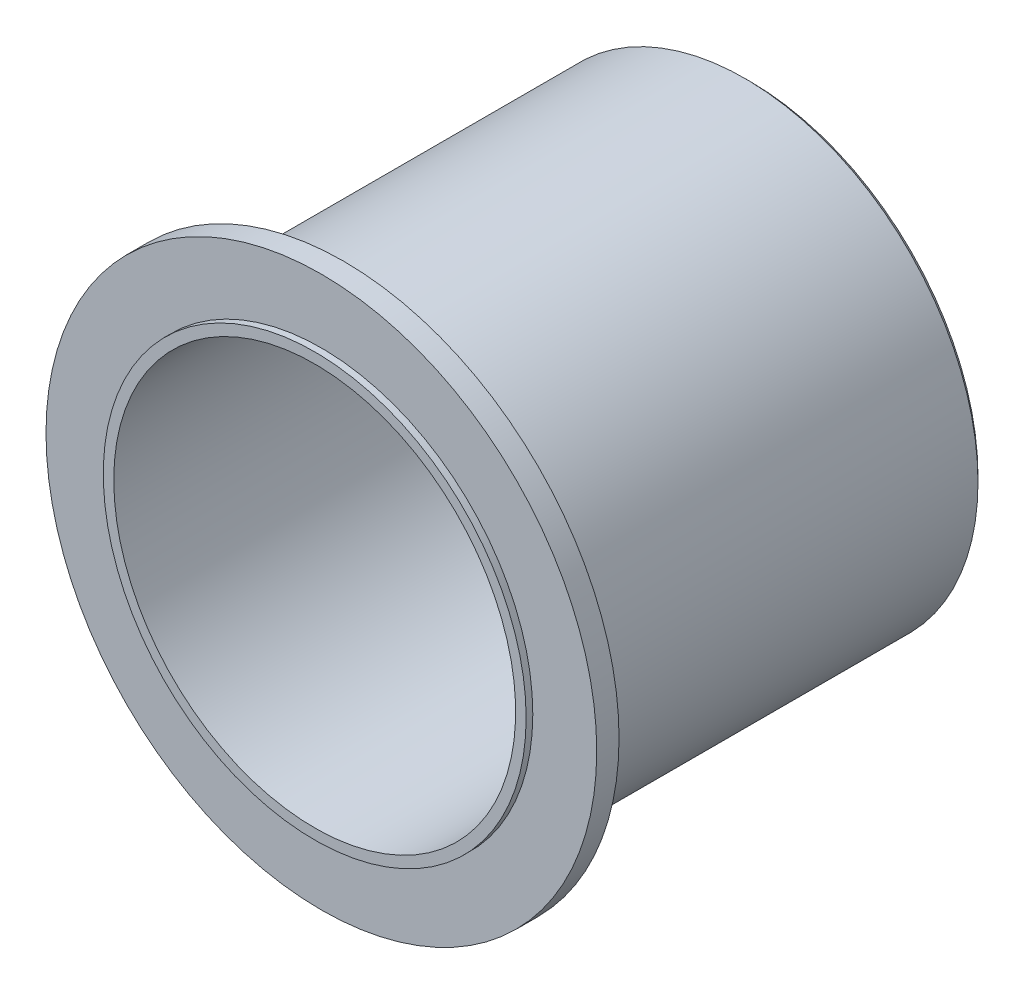
ISO-10303-21;
HEADER;
FILE_DESCRIPTION(('STEP AP214'),'2;1');
FILE_NAME('part.step','',(''),(''),'','','');
FILE_SCHEMA(('AUTOMOTIVE_DESIGN { 1 0 10303 214 1 1 1 1 }'));
ENDSEC;
DATA;
#1=APPLICATION_CONTEXT('core data for automotive mechanical design processes');
#2=APPLICATION_PROTOCOL_DEFINITION('international standard','automotive_design',2000,#1);
#3=PRODUCT_CONTEXT('',#1,'mechanical');
#4=PRODUCT('Part','Part','',(#3));
#5=PRODUCT_RELATED_PRODUCT_CATEGORY('part','',(#4));
#6=PRODUCT_DEFINITION_FORMATION('','',#4);
#7=PRODUCT_DEFINITION_CONTEXT('part definition',#1,'design');
#8=PRODUCT_DEFINITION('design','',#6,#7);
#9=PRODUCT_DEFINITION_SHAPE('','',#8);
#10=(LENGTH_UNIT() NAMED_UNIT(*) SI_UNIT(.MILLI.,.METRE.));
#11=(NAMED_UNIT(*) PLANE_ANGLE_UNIT() SI_UNIT($,.RADIAN.));
#12=(NAMED_UNIT(*) SI_UNIT($,.STERADIAN.) SOLID_ANGLE_UNIT());
#13=UNCERTAINTY_MEASURE_WITH_UNIT(LENGTH_MEASURE(1.E-05),#10,'distance_accuracy_value','');
#14=(GEOMETRIC_REPRESENTATION_CONTEXT(3) GLOBAL_UNCERTAINTY_ASSIGNED_CONTEXT((#13)) GLOBAL_UNIT_ASSIGNED_CONTEXT((#10,
#11,#12)) REPRESENTATION_CONTEXT('',''));
#15=CARTESIAN_POINT('',(0.,0.,0.));
#16=DIRECTION('',(0.,0.,1.));
#17=DIRECTION('',(1.,0.,0.));
#18=AXIS2_PLACEMENT_3D('',#15,#16,#17);
#19=CARTESIAN_POINT('',(-31.75,0.,0.));
#20=DIRECTION('',(0.,0.,-1.));
#21=DIRECTION('',(-1.,0.,0.));
#22=AXIS2_PLACEMENT_3D('',#19,#20,#21);
#23=PLANE('',#22);
#24=CARTESIAN_POINT('',(0.,0.,0.));
#25=DIRECTION('',(0.,0.,-1.));
#26=DIRECTION('',(-1.,0.,0.));
#27=AXIS2_PLACEMENT_3D('',#24,#25,#26);
#28=CIRCLE('',#27,30.175);
#29=CARTESIAN_POINT('',(-30.175,0.,0.));
#30=VERTEX_POINT('',#29);
#31=EDGE_CURVE('E73',#30,#30,#28,.T.);
#32=ORIENTED_EDGE('',*,*,#31,.T.);
#33=EDGE_LOOP('',(#32));
#34=FACE_BOUND('',#33,.T.);
#35=CARTESIAN_POINT('',(0.,0.,0.));
#36=DIRECTION('',(0.,0.,1.));
#37=DIRECTION('',(1.,0.,0.));
#38=AXIS2_PLACEMENT_3D('',#35,#36,#37);
#39=CIRCLE('',#38,31.75);
#40=CARTESIAN_POINT('',(31.75,0.,0.));
#41=VERTEX_POINT('',#40);
#42=EDGE_CURVE('E70',#41,#41,#39,.T.);
#43=ORIENTED_EDGE('',*,*,#42,.T.);
#44=EDGE_LOOP('',(#43));
#45=FACE_BOUND('',#44,.T.);
#46=ADVANCED_FACE('F32',(#34,#45),#23,.F.);
#47=CARTESIAN_POINT('',(0.,0.,-65.35));
#48=DIRECTION('',(0.,0.,1.));
#49=DIRECTION('',(1.,0.,0.));
#50=AXIS2_PLACEMENT_3D('',#47,#48,#49);
#51=PLANE('',#50);
#52=CARTESIAN_POINT('',(0.,0.,-65.35));
#53=DIRECTION('',(0.,0.,1.));
#54=DIRECTION('',(1.,0.,0.));
#55=AXIS2_PLACEMENT_3D('',#52,#53,#54);
#56=CIRCLE('',#55,33.175);
#57=CARTESIAN_POINT('',(33.175,0.,-65.35));
#58=VERTEX_POINT('',#57);
#59=EDGE_CURVE('E10',#58,#58,#56,.T.);
#60=ORIENTED_EDGE('',*,*,#59,.T.);
#61=EDGE_LOOP('',(#60));
#62=FACE_BOUND('',#61,.T.);
#63=CARTESIAN_POINT('',(0.,0.,-65.35));
#64=DIRECTION('',(0.,0.,1.));
#65=DIRECTION('',(1.,0.,0.));
#66=AXIS2_PLACEMENT_3D('',#63,#64,#65);
#67=CIRCLE('',#66,34.25);
#68=CARTESIAN_POINT('',(34.25,0.,-65.35));
#69=VERTEX_POINT('',#68);
#70=EDGE_CURVE('E52',#69,#69,#67,.F.);
#71=ORIENTED_EDGE('',*,*,#70,.T.);
#72=EDGE_LOOP('',(#71));
#73=FACE_BOUND('',#72,.T.);
#74=ADVANCED_FACE('F95',(#62,#73),#51,.F.);
#75=CARTESIAN_POINT('',(0.,0.,0.));
#76=DIRECTION('',(0.,0.,1.));
#77=DIRECTION('',(1.,0.,0.));
#78=AXIS2_PLACEMENT_3D('',#75,#76,#77);
#79=CYLINDRICAL_SURFACE('',#78,35.);
#80=CARTESIAN_POINT('',(0.,0.,-8.09999999999996));
#81=DIRECTION('',(0.,0.,1.));
#82=DIRECTION('',(1.,0.,0.));
#83=AXIS2_PLACEMENT_3D('',#80,#81,#82);
#84=CIRCLE('',#83,35.);
#85=CARTESIAN_POINT('',(35.,0.,-8.09999999999995));
#86=VERTEX_POINT('',#85);
#87=EDGE_CURVE('E55',#86,#86,#84,.F.);
#88=ORIENTED_EDGE('',*,*,#87,.T.);
#89=EDGE_LOOP('',(#88));
#90=FACE_BOUND('',#89,.T.);
#91=CARTESIAN_POINT('',(0.,0.,-64.6));
#92=DIRECTION('',(0.,0.,1.));
#93=DIRECTION('',(1.,0.,0.));
#94=AXIS2_PLACEMENT_3D('',#91,#92,#93);
#95=CIRCLE('',#94,35.);
#96=CARTESIAN_POINT('',(35.,0.,-64.6));
#97=VERTEX_POINT('',#96);
#98=EDGE_CURVE('E58',#97,#97,#95,.T.);
#99=ORIENTED_EDGE('',*,*,#98,.T.);
#100=EDGE_LOOP('',(#99));
#101=FACE_BOUND('',#100,.T.);
#102=ADVANCED_FACE('F100',(#90,#101),#79,.T.);
#103=CARTESIAN_POINT('',(-35.,0.,-7.34999999999999));
#104=DIRECTION('',(0.,0.,1.));
#105=DIRECTION('',(1.,0.,0.));
#106=AXIS2_PLACEMENT_3D('',#103,#104,#105);
#107=PLANE('',#106);
#108=CARTESIAN_POINT('',(0.,0.,-7.34999999999999));
#109=DIRECTION('',(0.,0.,1.));
#110=DIRECTION('',(1.,0.,0.));
#111=AXIS2_PLACEMENT_3D('',#108,#109,#110);
#112=CIRCLE('',#111,36.1538475772934);
#113=CARTESIAN_POINT('',(36.1538475772934,0.,-7.34999999999998));
#114=VERTEX_POINT('',#113);
#115=EDGE_CURVE('E43',#114,#114,#112,.F.);
#116=ORIENTED_EDGE('',*,*,#115,.T.);
#117=EDGE_LOOP('',(#116));
#118=FACE_BOUND('',#117,.T.);
#119=CARTESIAN_POINT('',(0.,0.,-7.34999999999999));
#120=DIRECTION('',(0.,0.,1.));
#121=DIRECTION('',(1.,0.,0.));
#122=AXIS2_PLACEMENT_3D('',#119,#120,#121);
#123=CIRCLE('',#122,35.75);
#124=CARTESIAN_POINT('',(35.75,0.,-7.34999999999998));
#125=VERTEX_POINT('',#124);
#126=EDGE_CURVE('E61',#125,#125,#123,.T.);
#127=ORIENTED_EDGE('',*,*,#126,.T.);
#128=EDGE_LOOP('',(#127));
#129=FACE_BOUND('',#128,.T.);
#130=ADVANCED_FACE('F129',(#118,#129),#107,.F.);
#131=CARTESIAN_POINT('',(0.,0.,0.));
#132=DIRECTION('',(0.,0.,1.));
#133=DIRECTION('',(1.,0.,0.));
#134=AXIS2_PLACEMENT_3D('',#131,#132,#133);
#135=CYLINDRICAL_SURFACE('',#134,41.35);
#136=CARTESIAN_POINT('',(0.,0.,-4.34999999999999));
#137=DIRECTION('',(0.,0.,1.));
#138=DIRECTION('',(1.,0.,0.));
#139=AXIS2_PLACEMENT_3D('',#136,#137,#138);
#140=CIRCLE('',#139,41.35);
#141=CARTESIAN_POINT('',(41.35,0.,-4.34999999999998));
#142=VERTEX_POINT('',#141);
#143=EDGE_CURVE('E47',#142,#142,#140,.T.);
#144=ORIENTED_EDGE('',*,*,#143,.T.);
#145=EDGE_LOOP('',(#144));
#146=FACE_BOUND('',#145,.T.);
#147=CARTESIAN_POINT('',(0.,0.,-0.999999999999986));
#148=DIRECTION('',(0.,0.,1.));
#149=DIRECTION('',(1.,0.,0.));
#150=AXIS2_PLACEMENT_3D('',#147,#148,#149);
#151=CIRCLE('',#150,41.35);
#152=CARTESIAN_POINT('',(41.35,0.,-0.999999999999977));
#153=VERTEX_POINT('',#152);
#154=EDGE_CURVE('E64',#153,#153,#151,.T.);
#155=ORIENTED_EDGE('',*,*,#154,.F.);
#156=EDGE_LOOP('',(#155));
#157=FACE_BOUND('',#156,.T.);
#158=ADVANCED_FACE('F126',(#146,#157),#135,.T.);
#159=CARTESIAN_POINT('',(-41.35,0.,-0.999999999999999));
#160=DIRECTION('',(0.,0.,-1.));
#161=DIRECTION('',(-1.,0.,0.));
#162=AXIS2_PLACEMENT_3D('',#159,#160,#161);
#163=PLANE('',#162);
#164=CARTESIAN_POINT('',(0.,0.,-0.999999999999993));
#165=DIRECTION('',(0.,0.,1.));
#166=DIRECTION('',(1.,0.,0.));
#167=AXIS2_PLACEMENT_3D('',#164,#165,#166);
#168=CIRCLE('',#167,31.75);
#169=CARTESIAN_POINT('',(31.75,0.,-0.999999999999987));
#170=VERTEX_POINT('',#169);
#171=EDGE_CURVE('E67',#170,#170,#168,.T.);
#172=ORIENTED_EDGE('',*,*,#171,.F.);
#173=EDGE_LOOP('',(#172));
#174=FACE_BOUND('',#173,.T.);
#175=ORIENTED_EDGE('',*,*,#154,.T.);
#176=EDGE_LOOP('',(#175));
#177=FACE_BOUND('',#176,.T.);
#178=ADVANCED_FACE('F91',(#174,#177),#163,.F.);
#179=CARTESIAN_POINT('',(0.,0.,0.));
#180=DIRECTION('',(0.,0.,1.));
#181=DIRECTION('',(1.,0.,0.));
#182=AXIS2_PLACEMENT_3D('',#179,#180,#181);
#183=CYLINDRICAL_SURFACE('',#182,31.75);
#184=ORIENTED_EDGE('',*,*,#42,.F.);
#185=EDGE_LOOP('',(#184));
#186=FACE_BOUND('',#185,.T.);
#187=ORIENTED_EDGE('',*,*,#171,.T.);
#188=EDGE_LOOP('',(#187));
#189=FACE_BOUND('',#188,.T.);
#190=ADVANCED_FACE('F82',(#186,#189),#183,.T.);
#191=CARTESIAN_POINT('',(0.,0.,0.));
#192=DIRECTION('',(0.,0.,-1.));
#193=DIRECTION('',(-1.,0.,0.));
#194=AXIS2_PLACEMENT_3D('',#191,#192,#193);
#195=CYLINDRICAL_SURFACE('',#194,30.175);
#196=CARTESIAN_POINT('',(0.,0.,-62.35));
#197=DIRECTION('',(0.,0.,1.));
#198=DIRECTION('',(1.,0.,0.));
#199=AXIS2_PLACEMENT_3D('',#196,#197,#198);
#200=CIRCLE('',#199,30.175);
#201=CARTESIAN_POINT('',(-30.175,0.,-62.35));
#202=VERTEX_POINT('',#201);
#203=EDGE_CURVE('E39',#202,#202,#200,.F.);
#204=CARTESIAN_POINT('',(-30.175,0.,-62.35));
#205=CARTESIAN_POINT('',(-30.175,0.,-61.7005208333333));
#206=CARTESIAN_POINT('',(-30.175,0.,-61.0510416666667));
#207=CARTESIAN_POINT('',(-30.175,0.,-59.7520833333333));
#208=CARTESIAN_POINT('',(-30.175,0.,-59.1026041666667));
#209=CARTESIAN_POINT('',(-30.175,0.,-57.8036458333333));
#210=CARTESIAN_POINT('',(-30.175,0.,-57.1541666666667));
#211=CARTESIAN_POINT('',(-30.175,0.,-55.8552083333333));
#212=CARTESIAN_POINT('',(-30.175,0.,-55.2057291666667));
#213=CARTESIAN_POINT('',(-30.175,0.,-53.9067708333333));
#214=CARTESIAN_POINT('',(-30.175,0.,-53.2572916666667));
#215=CARTESIAN_POINT('',(-30.175,0.,-51.9583333333333));
#216=CARTESIAN_POINT('',(-30.175,0.,-51.3088541666667));
#217=CARTESIAN_POINT('',(-30.175,0.,-50.0098958333333));
#218=CARTESIAN_POINT('',(-30.175,0.,-49.3604166666667));
#219=CARTESIAN_POINT('',(-30.175,0.,-48.0614583333333));
#220=CARTESIAN_POINT('',(-30.175,0.,-47.4119791666667));
#221=CARTESIAN_POINT('',(-30.175,0.,-46.1130208333333));
#222=CARTESIAN_POINT('',(-30.175,0.,-45.4635416666667));
#223=CARTESIAN_POINT('',(-30.175,0.,-44.1645833333333));
#224=CARTESIAN_POINT('',(-30.175,0.,-43.5151041666667));
#225=CARTESIAN_POINT('',(-30.175,0.,-42.2161458333333));
#226=CARTESIAN_POINT('',(-30.175,0.,-41.5666666666667));
#227=CARTESIAN_POINT('',(-30.175,0.,-40.2677083333333));
#228=CARTESIAN_POINT('',(-30.175,0.,-39.6182291666667));
#229=CARTESIAN_POINT('',(-30.175,0.,-38.3192708333333));
#230=CARTESIAN_POINT('',(-30.175,0.,-37.6697916666667));
#231=CARTESIAN_POINT('',(-30.175,0.,-36.3708333333333));
#232=CARTESIAN_POINT('',(-30.175,0.,-35.7213541666667));
#233=CARTESIAN_POINT('',(-30.175,0.,-34.4223958333333));
#234=CARTESIAN_POINT('',(-30.175,0.,-33.7729166666667));
#235=CARTESIAN_POINT('',(-30.175,0.,-32.4739583333333));
#236=CARTESIAN_POINT('',(-30.175,0.,-31.8244791666667));
#237=CARTESIAN_POINT('',(-30.175,0.,-30.5255208333333));
#238=CARTESIAN_POINT('',(-30.175,0.,-29.8760416666667));
#239=CARTESIAN_POINT('',(-30.175,0.,-28.5770833333333));
#240=CARTESIAN_POINT('',(-30.175,0.,-27.9276041666667));
#241=CARTESIAN_POINT('',(-30.175,0.,-26.6286458333333));
#242=CARTESIAN_POINT('',(-30.175,0.,-25.9791666666667));
#243=CARTESIAN_POINT('',(-30.175,0.,-24.6802083333333));
#244=CARTESIAN_POINT('',(-30.175,0.,-24.0307291666667));
#245=CARTESIAN_POINT('',(-30.175,0.,-22.7317708333333));
#246=CARTESIAN_POINT('',(-30.175,0.,-22.0822916666667));
#247=CARTESIAN_POINT('',(-30.175,0.,-20.7833333333333));
#248=CARTESIAN_POINT('',(-30.175,0.,-20.1338541666667));
#249=CARTESIAN_POINT('',(-30.175,0.,-18.8348958333333));
#250=CARTESIAN_POINT('',(-30.175,0.,-18.1854166666667));
#251=CARTESIAN_POINT('',(-30.175,0.,-16.8864583333333));
#252=CARTESIAN_POINT('',(-30.175,0.,-16.2369791666667));
#253=CARTESIAN_POINT('',(-30.175,0.,-14.9380208333333));
#254=CARTESIAN_POINT('',(-30.175,0.,-14.2885416666667));
#255=CARTESIAN_POINT('',(-30.175,0.,-12.9895833333333));
#256=CARTESIAN_POINT('',(-30.175,0.,-12.3401041666667));
#257=CARTESIAN_POINT('',(-30.175,0.,-11.0411458333333));
#258=CARTESIAN_POINT('',(-30.175,0.,-10.3916666666667));
#259=CARTESIAN_POINT('',(-30.175,0.,-9.09270833333332));
#260=CARTESIAN_POINT('',(-30.175,0.,-8.44322916666666));
#261=CARTESIAN_POINT('',(-30.175,0.,-7.14427083333333));
#262=CARTESIAN_POINT('',(-30.175,0.,-6.49479166666666));
#263=CARTESIAN_POINT('',(-30.175,0.,-5.19583333333332));
#264=CARTESIAN_POINT('',(-30.175,0.,-4.54635416666666));
#265=CARTESIAN_POINT('',(-30.175,0.,-3.24739583333333));
#266=CARTESIAN_POINT('',(-30.175,0.,-2.59791666666666));
#267=CARTESIAN_POINT('',(-30.175,0.,-1.29895833333332));
#268=CARTESIAN_POINT('',(-30.175,0.,-0.649479166666658));
#269=CARTESIAN_POINT('',(-30.175,0.,0.));
#270=B_SPLINE_CURVE_WITH_KNOTS('',3,(#204,#205,#206,#207,#208,#209,#210,#211,#212,#213,#214,
#215,#216,#217,#218,#219,#220,#221,#222,#223,#224,#225,#226,#227,#228,#229,#230,#231,#232,#233,
#234,#235,#236,#237,#238,#239,#240,#241,#242,#243,#244,#245,#246,#247,#248,#249,#250,#251,#252,
#253,#254,#255,#256,#257,#258,#259,#260,#261,#262,#263,#264,#265,#266,#267,#268,#269),
.UNSPECIFIED.,.F.,.F.,(4,2,2,2,2,2,2,2,2,2,2,2,2,2,2,2,2,2,2,2,2,2,2,2,2,2,2,2,2,2,2,2,4),(0.,
1.9484375,3.896875,5.8453125,7.79375,9.7421875,11.690625,13.6390625,15.5875,17.5359375,
19.484375,21.4328125,23.38125,25.3296875,27.278125,29.2265625,31.175,33.1234375,35.071875,
37.0203125,38.96875,40.9171875,42.865625,44.8140625,46.7625,48.7109375,50.659375,52.6078125,
54.55625,56.5046875,58.453125,60.4015625,62.35),.UNSPECIFIED.);
#271=EDGE_CURVE('BSEAM79',#202,#30,#270,.T.);
#272=ORIENTED_EDGE('',*,*,#203,.T.);
#273=ORIENTED_EDGE('',*,*,#31,.F.);
#274=ORIENTED_EDGE('',*,*,#271,.T.);
#275=ORIENTED_EDGE('',*,*,#271,.F.);
#276=EDGE_LOOP('',(#272,#274,#273,#275));
#277=FACE_BOUND('',#276,.T.);
#278=ADVANCED_FACE('F79',(#277),#195,.F.);
#279=CARTESIAN_POINT('',(0.,0.,-7.34999999999999));
#280=DIRECTION('',(0.,0.,1.));
#281=DIRECTION('',(1.,0.,0.));
#282=AXIS2_PLACEMENT_3D('',#279,#280,#281);
#283=CONICAL_SURFACE('',#282,35.75,0.785398163397456);
#284=ORIENTED_EDGE('',*,*,#87,.F.);
#285=EDGE_LOOP('',(#284));
#286=FACE_BOUND('',#285,.T.);
#287=ORIENTED_EDGE('',*,*,#126,.F.);
#288=EDGE_LOOP('',(#287));
#289=FACE_BOUND('',#288,.T.);
#290=ADVANCED_FACE('F81',(#286,#289),#283,.T.);
#291=CARTESIAN_POINT('',(0.,0.,-64.6));
#292=DIRECTION('',(0.,0.,1.));
#293=DIRECTION('',(1.,0.,0.));
#294=AXIS2_PLACEMENT_3D('',#291,#292,#293);
#295=CONICAL_SURFACE('',#294,35.,0.785398163397434);
#296=ORIENTED_EDGE('',*,*,#70,.F.);
#297=EDGE_LOOP('',(#296));
#298=FACE_BOUND('',#297,.T.);
#299=ORIENTED_EDGE('',*,*,#98,.F.);
#300=EDGE_LOOP('',(#299));
#301=FACE_BOUND('',#300,.T.);
#302=ADVANCED_FACE('F88',(#298,#301),#295,.T.);
#303=CARTESIAN_POINT('',(0.,0.,-4.34999999999999));
#304=DIRECTION('',(0.,0.,1.));
#305=DIRECTION('',(1.,0.,0.));
#306=AXIS2_PLACEMENT_3D('',#303,#304,#305);
#307=CONICAL_SURFACE('',#306,41.35,1.0471975511966);
#308=ORIENTED_EDGE('',*,*,#115,.F.);
#309=EDGE_LOOP('',(#308));
#310=FACE_BOUND('',#309,.T.);
#311=ORIENTED_EDGE('',*,*,#143,.F.);
#312=EDGE_LOOP('',(#311));
#313=FACE_BOUND('',#312,.T.);
#314=ADVANCED_FACE('F112',(#310,#313),#307,.T.);
#315=CARTESIAN_POINT('',(0.,0.,-62.35));
#316=DIRECTION('',(0.,0.,1.));
#317=DIRECTION('',(1.,0.,0.));
#318=AXIS2_PLACEMENT_3D('',#315,#316,#317);
#319=TOROIDAL_SURFACE('',#318,33.175,3.);
#320=ORIENTED_EDGE('',*,*,#59,.F.);
#321=EDGE_LOOP('',(#320));
#322=FACE_BOUND('',#321,.T.);
#323=ORIENTED_EDGE('',*,*,#203,.F.);
#324=EDGE_LOOP('',(#323));
#325=FACE_BOUND('',#324,.T.);
#326=ADVANCED_FACE('F34',(#322,#325),#319,.T.);
#327=CLOSED_SHELL('',(#46,#74,#102,#130,#158,#178,#190,#278,#290,#302,#314,#326));
#328=MANIFOLD_SOLID_BREP('B2',#327);
#329=ADVANCED_BREP_SHAPE_REPRESENTATION('',(#18,#328),#14);
#330=SHAPE_DEFINITION_REPRESENTATION(#9,#329);
ENDSEC;
END-ISO-10303-21;
